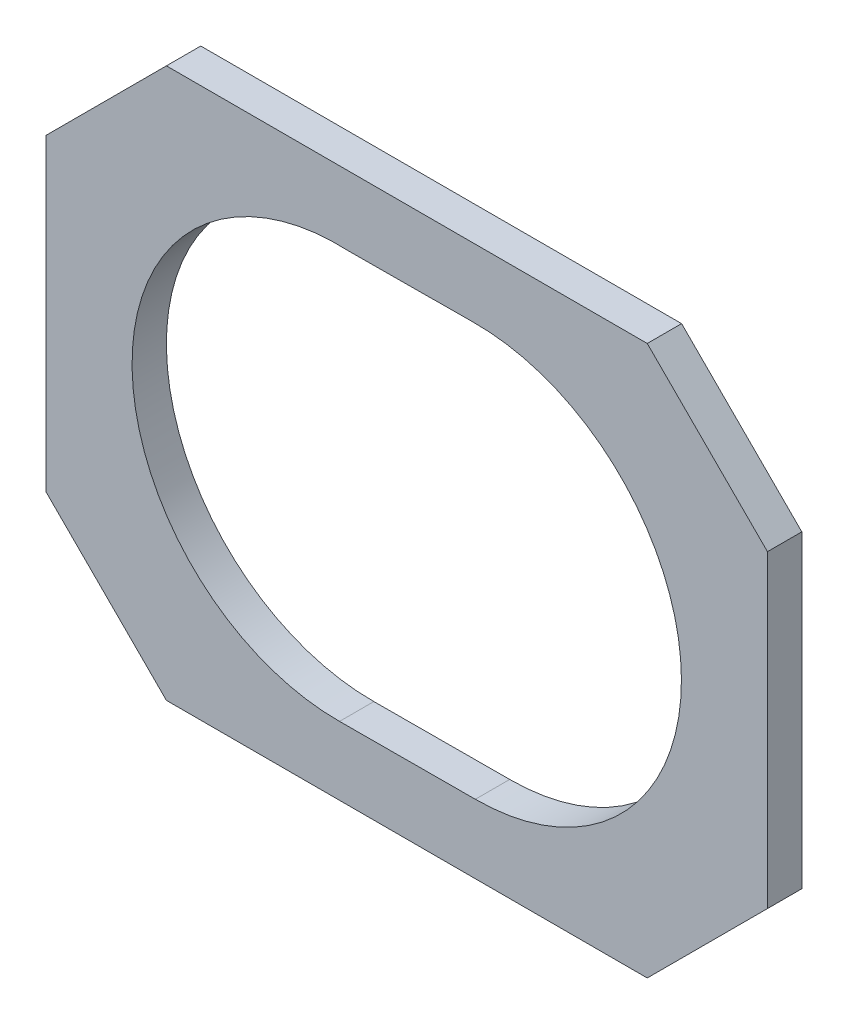
ISO-10303-21;
HEADER;
FILE_DESCRIPTION(('STEP AP214'),'2;1');
FILE_NAME('part.step','',(''),(''),'','','');
FILE_SCHEMA(('AUTOMOTIVE_DESIGN { 1 0 10303 214 1 1 1 1 }'));
ENDSEC;
DATA;
#1=APPLICATION_CONTEXT('core data for automotive mechanical design processes');
#2=APPLICATION_PROTOCOL_DEFINITION('international standard','automotive_design',2000,#1);
#3=PRODUCT_CONTEXT('',#1,'mechanical');
#4=PRODUCT('Part','Part','',(#3));
#5=PRODUCT_RELATED_PRODUCT_CATEGORY('part','',(#4));
#6=PRODUCT_DEFINITION_FORMATION('','',#4);
#7=PRODUCT_DEFINITION_CONTEXT('part definition',#1,'design');
#8=PRODUCT_DEFINITION('design','',#6,#7);
#9=PRODUCT_DEFINITION_SHAPE('','',#8);
#10=(LENGTH_UNIT() NAMED_UNIT(*) SI_UNIT(.MILLI.,.METRE.));
#11=(NAMED_UNIT(*) PLANE_ANGLE_UNIT() SI_UNIT($,.RADIAN.));
#12=(NAMED_UNIT(*) SI_UNIT($,.STERADIAN.) SOLID_ANGLE_UNIT());
#13=UNCERTAINTY_MEASURE_WITH_UNIT(LENGTH_MEASURE(1.E-05),#10,'distance_accuracy_value','');
#14=(GEOMETRIC_REPRESENTATION_CONTEXT(3) GLOBAL_UNCERTAINTY_ASSIGNED_CONTEXT((#13)) GLOBAL_UNIT_ASSIGNED_CONTEXT((#10,
#11,#12)) REPRESENTATION_CONTEXT('',''));
#15=CARTESIAN_POINT('',(0.,0.,0.));
#16=DIRECTION('',(0.,0.,1.));
#17=DIRECTION('',(1.,0.,0.));
#18=AXIS2_PLACEMENT_3D('',#15,#16,#17);
#19=CARTESIAN_POINT('',(-0.04374503514557,3.068360784084,3.606829571409));
#20=DIRECTION('',(0.,0.,1.));
#21=DIRECTION('',(1.,0.,0.));
#22=AXIS2_PLACEMENT_3D('',#19,#20,#21);
#23=PLANE('',#22);
#24=CARTESIAN_POINT('',(2.455250669942,4.669214402242,3.606829571409));
#25=DIRECTION('',(0.,0.,-1.));
#26=DIRECTION('',(-1.,0.,0.));
#27=AXIS2_PLACEMENT_3D('',#24,#25,#26);
#28=CIRCLE('',#27,1.2);
#29=CARTESIAN_POINT('',(2.44145758231927,5.86913512909605,3.606829571409));
#30=VERTEX_POINT('',#29);
#31=CARTESIAN_POINT('',(2.455250669942,3.469214402242,3.606829571409));
#32=VERTEX_POINT('',#31);
#33=EDGE_CURVE('E20',#30,#32,#28,.T.);
#34=ORIENTED_EDGE('',*,*,#33,.T.);
#35=DIRECTION('',(0.999994259703304,0.00338829757277903,0.));
#36=VECTOR('',#35,1.);
#37=CARTESIAN_POINT('',(2.455250669942,3.469214402242,3.606829571409));
#38=LINE('',#37,#36);
#39=CARTESIAN_POINT('',(1.664391127234,3.46653471939096,3.606829571409));
#40=VERTEX_POINT('',#39);
#41=EDGE_CURVE('E121',#32,#40,#38,.F.);
#42=ORIENTED_EDGE('',*,*,#41,.T.);
#43=CARTESIAN_POINT('',(1.656259259739,4.666507166046,3.606829571409));
#44=DIRECTION('',(0.,0.,-1.));
#45=DIRECTION('',(-1.,0.,0.));
#46=AXIS2_PLACEMENT_3D('',#43,#44,#45);
#47=CIRCLE('',#46,1.2);
#48=CARTESIAN_POINT('',(1.71695510519807,5.86497118901201,3.606829571409));
#49=VERTEX_POINT('',#48);
#50=EDGE_CURVE('E131',#40,#49,#47,.T.);
#51=ORIENTED_EDGE('',*,*,#50,.T.);
#52=DIRECTION('',(0.999983484624995,0.00574721473861654,0.));
#53=VECTOR('',#52,1.);
#54=CARTESIAN_POINT('',(1.716955105197,5.864971189012,3.606829571409));
#55=LINE('',#54,#53);
#56=EDGE_CURVE('E59',#49,#30,#55,.T.);
#57=ORIENTED_EDGE('',*,*,#56,.T.);
#58=EDGE_LOOP('',(#34,#42,#51,#57));
#59=FACE_BOUND('',#58,.T.);
#60=DIRECTION('',(-0.707106781149048,-0.707106781224047,0.));
#61=VECTOR('',#60,1.);
#62=CARTESIAN_POINT('',(3.45625496484,3.068360784084,3.606829571409));
#63=LINE('',#62,#61);
#64=CARTESIAN_POINT('',(3.45625496484,3.068360784084,3.606829571409));
#65=VERTEX_POINT('',#64);
#66=CARTESIAN_POINT('',(4.15625496482669,3.76836078414431,3.606829571409));
#67=VERTEX_POINT('',#66);
#68=EDGE_CURVE('E160',#65,#67,#63,.F.);
#69=ORIENTED_EDGE('',*,*,#68,.T.);
#70=DIRECTION('',(0.,1.,0.));
#71=VECTOR('',#70,1.);
#72=CARTESIAN_POINT('',(4.156254964827,3.768360784144,3.606829571409));
#73=LINE('',#72,#71);
#74=CARTESIAN_POINT('',(4.156254964827,5.568360784144,3.606829571409));
#75=VERTEX_POINT('',#74);
#76=EDGE_CURVE('E155',#67,#75,#73,.T.);
#77=ORIENTED_EDGE('',*,*,#76,.T.);
#78=DIRECTION('',(0.707106781149048,-0.707106781224047,0.));
#79=VECTOR('',#78,1.);
#80=CARTESIAN_POINT('',(4.156254964827,5.568360784144,3.606829571409));
#81=LINE('',#80,#79);
#82=CARTESIAN_POINT('',(3.45625496484056,6.26836078420356,3.606829571409));
#83=VERTEX_POINT('',#82);
#84=EDGE_CURVE('E150',#75,#83,#81,.F.);
#85=ORIENTED_EDGE('',*,*,#84,.T.);
#86=DIRECTION('',(1.,0.,0.));
#87=VECTOR('',#86,1.);
#88=CARTESIAN_POINT('',(3.45625496484,6.268360784203,3.606829571409));
#89=LINE('',#88,#87);
#90=CARTESIAN_POINT('',(0.65625496484,6.268360784203,3.606829571409));
#91=VERTEX_POINT('',#90);
#92=EDGE_CURVE('E103',#83,#91,#89,.F.);
#93=ORIENTED_EDGE('',*,*,#92,.T.);
#94=DIRECTION('',(0.707106781149048,0.707106781224047,0.));
#95=VECTOR('',#94,1.);
#96=CARTESIAN_POINT('',(0.65625496484,6.268360784203,3.606829571409));
#97=LINE('',#96,#95);
#98=CARTESIAN_POINT('',(-0.0437450351453659,5.5683607841438,3.606829571409));
#99=VERTEX_POINT('',#98);
#100=EDGE_CURVE('E101',#91,#99,#97,.F.);
#101=ORIENTED_EDGE('',*,*,#100,.T.);
#102=DIRECTION('',(0.,1.,0.));
#103=VECTOR('',#102,1.);
#104=CARTESIAN_POINT('',(-0.04374503514557,5.568360784144,3.606829571409));
#105=LINE('',#104,#103);
#106=CARTESIAN_POINT('',(-0.04374503514557,3.768360784144,3.606829571409));
#107=VERTEX_POINT('',#106);
#108=EDGE_CURVE('E98',#99,#107,#105,.F.);
#109=ORIENTED_EDGE('',*,*,#108,.T.);
#110=DIRECTION('',(-0.707106781149048,0.707106781224047,0.));
#111=VECTOR('',#110,1.);
#112=CARTESIAN_POINT('',(-0.04374503514557,3.768360784144,3.606829571409));
#113=LINE('',#112,#111);
#114=CARTESIAN_POINT('',(0.656254964840046,3.06836078408405,3.606829571409));
#115=VERTEX_POINT('',#114);
#116=EDGE_CURVE('E170',#107,#115,#113,.F.);
#117=ORIENTED_EDGE('',*,*,#116,.T.);
#118=DIRECTION('',(1.,0.,0.));
#119=VECTOR('',#118,1.);
#120=CARTESIAN_POINT('',(0.65625496484,3.068360784084,3.606829571409));
#121=LINE('',#120,#119);
#122=EDGE_CURVE('E165',#115,#65,#121,.T.);
#123=ORIENTED_EDGE('',*,*,#122,.T.);
#124=EDGE_LOOP('',(#69,#77,#85,#93,#101,#109,#117,#123));
#125=FACE_BOUND('',#124,.T.);
#126=ADVANCED_FACE('F17',(#59,#125),#23,.T.);
#127=CARTESIAN_POINT('',(0.65625496484,6.268360784203,3.606829571409));
#128=DIRECTION('',(0.707106781224047,-0.707106781149048,0.));
#129=DIRECTION('',(0.707106781149048,0.707106781224047,0.));
#130=AXIS2_PLACEMENT_3D('',#127,#128,#129);
#131=PLANE('',#130);
#132=ORIENTED_EDGE('',*,*,#100,.F.);
#133=DIRECTION('',(0.,0.,-1.));
#134=VECTOR('',#133,1.);
#135=CARTESIAN_POINT('',(0.65625496484,6.268360784203,3.606829571409));
#136=LINE('',#135,#134);
#137=CARTESIAN_POINT('',(0.65625496484,6.268360784203,3.406829571409));
#138=VERTEX_POINT('',#137);
#139=EDGE_CURVE('E144',#91,#138,#136,.T.);
#140=ORIENTED_EDGE('',*,*,#139,.T.);
#141=DIRECTION('',(-0.70710678114946,-0.707106781223635,0.));
#142=VECTOR('',#141,1.);
#143=CARTESIAN_POINT('',(0.65625496484,6.268360784203,3.406829571409));
#144=LINE('',#143,#142);
#145=CARTESIAN_POINT('',(-0.0437450351453659,5.5683607841438,3.406829571409));
#146=VERTEX_POINT('',#145);
#147=EDGE_CURVE('E68',#138,#146,#144,.T.);
#148=ORIENTED_EDGE('',*,*,#147,.T.);
#149=DIRECTION('',(0.,0.,-1.));
#150=VECTOR('',#149,1.);
#151=CARTESIAN_POINT('',(-0.04374503514557,5.568360784144,3.606829571409));
#152=LINE('',#151,#150);
#153=EDGE_CURVE('E107',#146,#99,#152,.F.);
#154=ORIENTED_EDGE('',*,*,#153,.T.);
#155=EDGE_LOOP('',(#132,#140,#148,#154));
#156=FACE_BOUND('',#155,.T.);
#157=ADVANCED_FACE('F116',(#156),#131,.F.);
#158=CARTESIAN_POINT('',(-0.04374503514557,5.568360784144,3.606829571409));
#159=DIRECTION('',(1.,0.,0.));
#160=DIRECTION('',(0.,0.,-1.));
#161=AXIS2_PLACEMENT_3D('',#158,#159,#160);
#162=PLANE('',#161);
#163=ORIENTED_EDGE('',*,*,#108,.F.);
#164=ORIENTED_EDGE('',*,*,#153,.F.);
#165=DIRECTION('',(0.,1.,0.));
#166=VECTOR('',#165,1.);
#167=CARTESIAN_POINT('',(-0.04374503514557,3.068360784084,3.406829571409));
#168=LINE('',#167,#166);
#169=CARTESIAN_POINT('',(-0.04374503514557,3.768360784144,3.406829571409));
#170=VERTEX_POINT('',#169);
#171=EDGE_CURVE('E187',#146,#170,#168,.F.);
#172=ORIENTED_EDGE('',*,*,#171,.T.);
#173=DIRECTION('',(0.,0.,1.));
#174=VECTOR('',#173,1.);
#175=CARTESIAN_POINT('',(-0.04374503514557,3.768360784144,3.606829571409));
#176=LINE('',#175,#174);
#177=EDGE_CURVE('E114',#170,#107,#176,.T.);
#178=ORIENTED_EDGE('',*,*,#177,.T.);
#179=EDGE_LOOP('',(#163,#164,#172,#178));
#180=FACE_BOUND('',#179,.T.);
#181=ADVANCED_FACE('F111',(#180),#162,.F.);
#182=CARTESIAN_POINT('',(-0.04374503514557,3.768360784144,3.606829571409));
#183=DIRECTION('',(0.707106781224047,0.707106781149048,0.));
#184=DIRECTION('',(-0.707106781149048,0.707106781224047,0.));
#185=AXIS2_PLACEMENT_3D('',#182,#183,#184);
#186=PLANE('',#185);
#187=ORIENTED_EDGE('',*,*,#116,.F.);
#188=ORIENTED_EDGE('',*,*,#177,.F.);
#189=DIRECTION('',(0.707106781148955,-0.70710678122414,0.));
#190=VECTOR('',#189,1.);
#191=CARTESIAN_POINT('',(-0.04374503514557,3.768360784144,3.406829571409));
#192=LINE('',#191,#190);
#193=CARTESIAN_POINT('',(0.656254964840046,3.06836078408405,3.406829571409));
#194=VERTEX_POINT('',#193);
#195=EDGE_CURVE('E184',#170,#194,#192,.T.);
#196=ORIENTED_EDGE('',*,*,#195,.T.);
#197=DIRECTION('',(0.,0.,1.));
#198=VECTOR('',#197,1.);
#199=CARTESIAN_POINT('',(0.65625496484,3.068360784084,3.606829571409));
#200=LINE('',#199,#198);
#201=EDGE_CURVE('E167',#194,#115,#200,.T.);
#202=ORIENTED_EDGE('',*,*,#201,.T.);
#203=EDGE_LOOP('',(#187,#188,#196,#202));
#204=FACE_BOUND('',#203,.T.);
#205=ADVANCED_FACE('F182',(#204),#186,.F.);
#206=CARTESIAN_POINT('',(0.65625496484,3.068360784084,3.606829571409));
#207=DIRECTION('',(0.,1.,0.));
#208=DIRECTION('',(0.,0.,1.));
#209=AXIS2_PLACEMENT_3D('',#206,#207,#208);
#210=PLANE('',#209);
#211=ORIENTED_EDGE('',*,*,#122,.F.);
#212=ORIENTED_EDGE('',*,*,#201,.F.);
#213=DIRECTION('',(1.,0.,0.));
#214=VECTOR('',#213,1.);
#215=CARTESIAN_POINT('',(-0.04374503514557,3.068360784084,3.406829571409));
#216=LINE('',#215,#214);
#217=CARTESIAN_POINT('',(3.45625496484,3.068360784084,3.406829571409));
#218=VERTEX_POINT('',#217);
#219=EDGE_CURVE('E186',#194,#218,#216,.T.);
#220=ORIENTED_EDGE('',*,*,#219,.T.);
#221=DIRECTION('',(0.,0.,1.));
#222=VECTOR('',#221,1.);
#223=CARTESIAN_POINT('',(3.45625496484,3.068360784084,3.606829571409));
#224=LINE('',#223,#222);
#225=EDGE_CURVE('E162',#218,#65,#224,.T.);
#226=ORIENTED_EDGE('',*,*,#225,.T.);
#227=EDGE_LOOP('',(#211,#212,#220,#226));
#228=FACE_BOUND('',#227,.T.);
#229=ADVANCED_FACE('F176',(#228),#210,.F.);
#230=CARTESIAN_POINT('',(3.45625496484,3.068360784084,3.606829571409));
#231=DIRECTION('',(-0.707106781224047,0.707106781149048,0.));
#232=DIRECTION('',(-0.707106781149048,-0.707106781224047,0.));
#233=AXIS2_PLACEMENT_3D('',#230,#231,#232);
#234=PLANE('',#233);
#235=ORIENTED_EDGE('',*,*,#68,.F.);
#236=ORIENTED_EDGE('',*,*,#225,.F.);
#237=DIRECTION('',(0.707106781149677,0.707106781223418,0.));
#238=VECTOR('',#237,1.);
#239=CARTESIAN_POINT('',(3.45625496484,3.068360784084,3.406829571409));
#240=LINE('',#239,#238);
#241=CARTESIAN_POINT('',(4.15625496482669,3.76836078414431,3.406829571409));
#242=VERTEX_POINT('',#241);
#243=EDGE_CURVE('E189',#218,#242,#240,.T.);
#244=ORIENTED_EDGE('',*,*,#243,.T.);
#245=DIRECTION('',(0.,0.,1.));
#246=VECTOR('',#245,1.);
#247=CARTESIAN_POINT('',(4.156254964827,3.768360784144,3.606829571409));
#248=LINE('',#247,#246);
#249=EDGE_CURVE('E157',#242,#67,#248,.T.);
#250=ORIENTED_EDGE('',*,*,#249,.T.);
#251=EDGE_LOOP('',(#235,#236,#244,#250));
#252=FACE_BOUND('',#251,.T.);
#253=ADVANCED_FACE('F217',(#252),#234,.F.);
#254=CARTESIAN_POINT('',(4.156254964827,3.768360784144,3.606829571409));
#255=DIRECTION('',(-1.,0.,0.));
#256=DIRECTION('',(0.,0.,1.));
#257=AXIS2_PLACEMENT_3D('',#254,#255,#256);
#258=PLANE('',#257);
#259=ORIENTED_EDGE('',*,*,#76,.F.);
#260=ORIENTED_EDGE('',*,*,#249,.F.);
#261=DIRECTION('',(0.,1.,0.));
#262=VECTOR('',#261,1.);
#263=CARTESIAN_POINT('',(4.156254964827,3.068360784084,3.406829571409));
#264=LINE('',#263,#262);
#265=CARTESIAN_POINT('',(4.156254964827,5.568360784144,3.406829571409));
#266=VERTEX_POINT('',#265);
#267=EDGE_CURVE('E211',#242,#266,#264,.T.);
#268=ORIENTED_EDGE('',*,*,#267,.T.);
#269=DIRECTION('',(0.,0.,1.));
#270=VECTOR('',#269,1.);
#271=CARTESIAN_POINT('',(4.156254964827,5.568360784144,3.606829571409));
#272=LINE('',#271,#270);
#273=EDGE_CURVE('E152',#266,#75,#272,.T.);
#274=ORIENTED_EDGE('',*,*,#273,.T.);
#275=EDGE_LOOP('',(#259,#260,#268,#274));
#276=FACE_BOUND('',#275,.T.);
#277=ADVANCED_FACE('F235',(#276),#258,.F.);
#278=CARTESIAN_POINT('',(4.156254964827,5.568360784144,3.606829571409));
#279=DIRECTION('',(-0.707106781224047,-0.707106781149048,0.));
#280=DIRECTION('',(0.707106781149048,-0.707106781224047,0.));
#281=AXIS2_PLACEMENT_3D('',#278,#279,#280);
#282=PLANE('',#281);
#283=ORIENTED_EDGE('',*,*,#84,.F.);
#284=ORIENTED_EDGE('',*,*,#273,.F.);
#285=DIRECTION('',(-0.707106781150182,0.707106781222913,0.));
#286=VECTOR('',#285,1.);
#287=CARTESIAN_POINT('',(4.156254964827,5.568360784144,3.406829571409));
#288=LINE('',#287,#286);
#289=CARTESIAN_POINT('',(3.45625496484056,6.26836078420356,3.406829571409));
#290=VERTEX_POINT('',#289);
#291=EDGE_CURVE('E208',#266,#290,#288,.T.);
#292=ORIENTED_EDGE('',*,*,#291,.T.);
#293=DIRECTION('',(0.,0.,-1.));
#294=VECTOR('',#293,1.);
#295=CARTESIAN_POINT('',(3.45625496484,6.268360784203,3.606829571409));
#296=LINE('',#295,#294);
#297=EDGE_CURVE('E147',#290,#83,#296,.F.);
#298=ORIENTED_EDGE('',*,*,#297,.T.);
#299=EDGE_LOOP('',(#283,#284,#292,#298));
#300=FACE_BOUND('',#299,.T.);
#301=ADVANCED_FACE('F232',(#300),#282,.F.);
#302=CARTESIAN_POINT('',(3.45625496484,6.268360784203,3.606829571409));
#303=DIRECTION('',(0.,-1.,0.));
#304=DIRECTION('',(0.,0.,-1.));
#305=AXIS2_PLACEMENT_3D('',#302,#303,#304);
#306=PLANE('',#305);
#307=ORIENTED_EDGE('',*,*,#92,.F.);
#308=ORIENTED_EDGE('',*,*,#297,.F.);
#309=DIRECTION('',(1.,0.,0.));
#310=VECTOR('',#309,1.);
#311=CARTESIAN_POINT('',(-0.04374503514557,6.268360784203,3.406829571409));
#312=LINE('',#311,#310);
#313=EDGE_CURVE('E130',#290,#138,#312,.F.);
#314=ORIENTED_EDGE('',*,*,#313,.T.);
#315=ORIENTED_EDGE('',*,*,#139,.F.);
#316=EDGE_LOOP('',(#307,#308,#314,#315));
#317=FACE_BOUND('',#316,.T.);
#318=ADVANCED_FACE('F229',(#317),#306,.F.);
#319=CARTESIAN_POINT('',(2.455250669942,4.669214402242,3.606829571409));
#320=DIRECTION('',(0.,0.,-1.));
#321=DIRECTION('',(-1.,0.,0.));
#322=AXIS2_PLACEMENT_3D('',#319,#320,#321);
#323=CYLINDRICAL_SURFACE('',#322,1.2);
#324=ORIENTED_EDGE('',*,*,#33,.F.);
#325=DIRECTION('',(0.,0.,1.));
#326=VECTOR('',#325,1.);
#327=CARTESIAN_POINT('',(2.441457582369,5.86913512909666,3.606829571409));
#328=LINE('',#327,#326);
#329=CARTESIAN_POINT('',(2.44145758231927,5.86913512909605,3.406829571409));
#330=VERTEX_POINT('',#329);
#331=EDGE_CURVE('E133',#30,#330,#328,.F.);
#332=ORIENTED_EDGE('',*,*,#331,.T.);
#333=CARTESIAN_POINT('',(2.455250669942,4.669214402242,3.406829571409));
#334=DIRECTION('',(0.,0.,-1.));
#335=DIRECTION('',(-1.,0.,0.));
#336=AXIS2_PLACEMENT_3D('',#333,#334,#335);
#337=CIRCLE('',#336,1.2);
#338=CARTESIAN_POINT('',(2.455250669942,3.469214402242,3.406829571409));
#339=VERTEX_POINT('',#338);
#340=EDGE_CURVE('E128',#330,#339,#337,.T.);
#341=ORIENTED_EDGE('',*,*,#340,.T.);
#342=DIRECTION('',(0.,0.,1.));
#343=VECTOR('',#342,1.);
#344=CARTESIAN_POINT('',(2.455250669942,3.469214402242,3.606829571409));
#345=LINE('',#344,#343);
#346=EDGE_CURVE('E125',#339,#32,#345,.T.);
#347=ORIENTED_EDGE('',*,*,#346,.T.);
#348=EDGE_LOOP('',(#324,#332,#341,#347));
#349=FACE_BOUND('',#348,.T.);
#350=ADVANCED_FACE('F197',(#349),#323,.F.);
#351=CARTESIAN_POINT('',(2.455250669942,3.469214402242,3.606829571409));
#352=DIRECTION('',(0.00338829757277903,-0.999994259703304,0.));
#353=DIRECTION('',(0.999994259703304,0.00338829757277903,0.));
#354=AXIS2_PLACEMENT_3D('',#351,#352,#353);
#355=PLANE('',#354);
#356=ORIENTED_EDGE('',*,*,#41,.F.);
#357=ORIENTED_EDGE('',*,*,#346,.F.);
#358=DIRECTION('',(-0.999994259703304,-0.00338829757260086,0.));
#359=VECTOR('',#358,1.);
#360=CARTESIAN_POINT('',(2.455250669942,3.469214402242,3.406829571409));
#361=LINE('',#360,#359);
#362=CARTESIAN_POINT('',(1.664391127234,3.46653471939104,3.406829571409));
#363=VERTEX_POINT('',#362);
#364=EDGE_CURVE('E127',#339,#363,#361,.T.);
#365=ORIENTED_EDGE('',*,*,#364,.T.);
#366=DIRECTION('',(0.,0.,-1.));
#367=VECTOR('',#366,1.);
#368=CARTESIAN_POINT('',(1.664391127234,3.46653471939106,3.606829571409));
#369=LINE('',#368,#367);
#370=EDGE_CURVE('E124',#363,#40,#369,.F.);
#371=ORIENTED_EDGE('',*,*,#370,.T.);
#372=EDGE_LOOP('',(#356,#357,#365,#371));
#373=FACE_BOUND('',#372,.T.);
#374=ADVANCED_FACE('F255',(#373),#355,.F.);
#375=CARTESIAN_POINT('',(1.656259259739,4.666507166046,3.606829571409));
#376=DIRECTION('',(0.,0.,-1.));
#377=DIRECTION('',(-1.,0.,0.));
#378=AXIS2_PLACEMENT_3D('',#375,#376,#377);
#379=CYLINDRICAL_SURFACE('',#378,1.2);
#380=ORIENTED_EDGE('',*,*,#50,.F.);
#381=ORIENTED_EDGE('',*,*,#370,.F.);
#382=CARTESIAN_POINT('',(1.656259259739,4.666507166046,3.406829571409));
#383=DIRECTION('',(0.,0.,-1.));
#384=DIRECTION('',(-1.,0.,0.));
#385=AXIS2_PLACEMENT_3D('',#382,#383,#384);
#386=CIRCLE('',#385,1.2);
#387=CARTESIAN_POINT('',(1.71695510519807,5.86497118901201,3.406829571409));
#388=VERTEX_POINT('',#387);
#389=EDGE_CURVE('E26',#363,#388,#386,.T.);
#390=ORIENTED_EDGE('',*,*,#389,.T.);
#391=DIRECTION('',(0.,0.,1.));
#392=VECTOR('',#391,1.);
#393=CARTESIAN_POINT('',(1.716955105197,5.864971189012,3.606829571409));
#394=LINE('',#393,#392);
#395=EDGE_CURVE('E132',#388,#49,#394,.T.);
#396=ORIENTED_EDGE('',*,*,#395,.T.);
#397=EDGE_LOOP('',(#380,#381,#390,#396));
#398=FACE_BOUND('',#397,.T.);
#399=ADVANCED_FACE('F250',(#398),#379,.F.);
#400=CARTESIAN_POINT('',(1.716955105197,5.864971189012,3.606829571409));
#401=DIRECTION('',(-0.00574721473953194,0.99998348462499,0.));
#402=DIRECTION('',(-0.99998348462499,-0.00574721473953194,0.));
#403=AXIS2_PLACEMENT_3D('',#400,#401,#402);
#404=PLANE('',#403);
#405=ORIENTED_EDGE('',*,*,#56,.F.);
#406=ORIENTED_EDGE('',*,*,#395,.F.);
#407=DIRECTION('',(0.999983484624995,0.00574721473861654,0.));
#408=VECTOR('',#407,1.);
#409=CARTESIAN_POINT('',(1.716955105197,5.864971189012,3.406829571409));
#410=LINE('',#409,#408);
#411=EDGE_CURVE('E11',#388,#330,#410,.T.);
#412=ORIENTED_EDGE('',*,*,#411,.T.);
#413=ORIENTED_EDGE('',*,*,#331,.F.);
#414=EDGE_LOOP('',(#405,#406,#412,#413));
#415=FACE_BOUND('',#414,.T.);
#416=ADVANCED_FACE('F200',(#415),#404,.F.);
#417=CARTESIAN_POINT('',(-0.04374503514557,3.068360784084,3.406829571409));
#418=DIRECTION('',(0.,0.,1.));
#419=DIRECTION('',(1.,0.,0.));
#420=AXIS2_PLACEMENT_3D('',#417,#418,#419);
#421=PLANE('',#420);
#422=ORIENTED_EDGE('',*,*,#411,.F.);
#423=ORIENTED_EDGE('',*,*,#389,.F.);
#424=ORIENTED_EDGE('',*,*,#364,.F.);
#425=ORIENTED_EDGE('',*,*,#340,.F.);
#426=EDGE_LOOP('',(#422,#423,#424,#425));
#427=FACE_BOUND('',#426,.T.);
#428=ORIENTED_EDGE('',*,*,#291,.F.);
#429=ORIENTED_EDGE('',*,*,#267,.F.);
#430=ORIENTED_EDGE('',*,*,#243,.F.);
#431=ORIENTED_EDGE('',*,*,#219,.F.);
#432=ORIENTED_EDGE('',*,*,#195,.F.);
#433=ORIENTED_EDGE('',*,*,#171,.F.);
#434=ORIENTED_EDGE('',*,*,#147,.F.);
#435=ORIENTED_EDGE('',*,*,#313,.F.);
#436=EDGE_LOOP('',(#428,#429,#430,#431,#432,#433,#434,#435));
#437=FACE_BOUND('',#436,.T.);
#438=ADVANCED_FACE('F202',(#427,#437),#421,.F.);
#439=CLOSED_SHELL('',(#126,#157,#181,#205,#229,#253,#277,#301,#318,#350,#374,#399,#416,#438));
#440=MANIFOLD_SOLID_BREP('B1',#439);
#441=ADVANCED_BREP_SHAPE_REPRESENTATION('',(#18,#440),#14);
#442=SHAPE_DEFINITION_REPRESENTATION(#9,#441);
ENDSEC;
END-ISO-10303-21;
